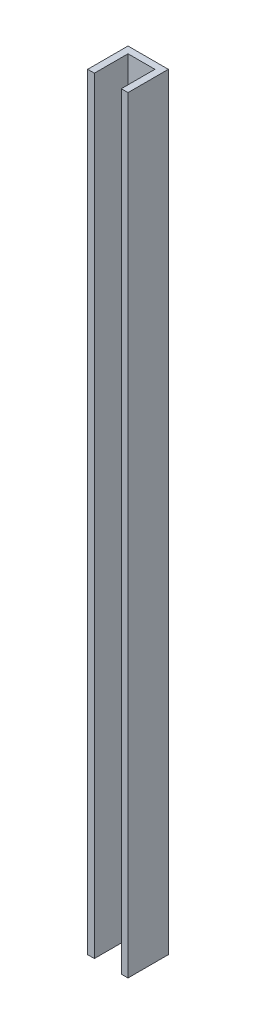
ISO-10303-21;
HEADER;
FILE_DESCRIPTION(('STEP AP214'),'2;1');
FILE_NAME('part.step','',(''),(''),'','','');
FILE_SCHEMA(('AUTOMOTIVE_DESIGN { 1 0 10303 214 1 1 1 1 }'));
ENDSEC;
DATA;
#1=APPLICATION_CONTEXT('core data for automotive mechanical design processes');
#2=APPLICATION_PROTOCOL_DEFINITION('international standard','automotive_design',2000,#1);
#3=PRODUCT_CONTEXT('',#1,'mechanical');
#4=PRODUCT('Part','Part','',(#3));
#5=PRODUCT_RELATED_PRODUCT_CATEGORY('part','',(#4));
#6=PRODUCT_DEFINITION_FORMATION('','',#4);
#7=PRODUCT_DEFINITION_CONTEXT('part definition',#1,'design');
#8=PRODUCT_DEFINITION('design','',#6,#7);
#9=PRODUCT_DEFINITION_SHAPE('','',#8);
#10=(LENGTH_UNIT() NAMED_UNIT(*) SI_UNIT(.MILLI.,.METRE.));
#11=(NAMED_UNIT(*) PLANE_ANGLE_UNIT() SI_UNIT($,.RADIAN.));
#12=(NAMED_UNIT(*) SI_UNIT($,.STERADIAN.) SOLID_ANGLE_UNIT());
#13=UNCERTAINTY_MEASURE_WITH_UNIT(LENGTH_MEASURE(1.E-05),#10,'distance_accuracy_value','');
#14=(GEOMETRIC_REPRESENTATION_CONTEXT(3) GLOBAL_UNCERTAINTY_ASSIGNED_CONTEXT((#13)) GLOBAL_UNIT_ASSIGNED_CONTEXT((#10,
#11,#12)) REPRESENTATION_CONTEXT('',''));
#15=CARTESIAN_POINT('',(0.,0.,0.));
#16=DIRECTION('',(0.,0.,1.));
#17=DIRECTION('',(1.,0.,0.));
#18=AXIS2_PLACEMENT_3D('',#15,#16,#17);
#19=CARTESIAN_POINT('',(3.175,361.95,0.));
#20=DIRECTION('',(0.,0.,-1.));
#21=DIRECTION('',(-1.,0.,0.));
#22=AXIS2_PLACEMENT_3D('',#19,#20,#21);
#23=PLANE('',#22);
#24=DIRECTION('',(1.,0.,0.));
#25=VECTOR('',#24,1.);
#26=CARTESIAN_POINT('',(3.175,0.,0.));
#27=LINE('',#26,#25);
#28=CARTESIAN_POINT('',(0.,0.,0.));
#29=VERTEX_POINT('',#28);
#30=CARTESIAN_POINT('',(3.175,0.,0.));
#31=VERTEX_POINT('',#30);
#32=EDGE_CURVE('E130',#29,#31,#27,.T.);
#33=ORIENTED_EDGE('',*,*,#32,.T.);
#34=DIRECTION('',(0.,-1.,0.));
#35=VECTOR('',#34,1.);
#36=CARTESIAN_POINT('',(3.175,361.95,0.));
#37=LINE('',#36,#35);
#38=CARTESIAN_POINT('',(3.175,361.95,0.));
#39=VERTEX_POINT('',#38);
#40=EDGE_CURVE('E11',#39,#31,#37,.T.);
#41=ORIENTED_EDGE('',*,*,#40,.F.);
#42=DIRECTION('',(1.,0.,0.));
#43=VECTOR('',#42,1.);
#44=CARTESIAN_POINT('',(3.175,361.95,0.));
#45=LINE('',#44,#43);
#46=CARTESIAN_POINT('',(0.,361.95,0.));
#47=VERTEX_POINT('',#46);
#48=EDGE_CURVE('E144',#47,#39,#45,.T.);
#49=ORIENTED_EDGE('',*,*,#48,.F.);
#50=DIRECTION('',(0.,-1.,0.));
#51=VECTOR('',#50,1.);
#52=CARTESIAN_POINT('',(0.,361.95,0.));
#53=LINE('',#52,#51);
#54=EDGE_CURVE('E126',#47,#29,#53,.T.);
#55=ORIENTED_EDGE('',*,*,#54,.T.);
#56=EDGE_LOOP('',(#33,#41,#49,#55));
#57=FACE_BOUND('',#56,.T.);
#58=ADVANCED_FACE('F34',(#57),#23,.F.);
#59=CARTESIAN_POINT('',(3.175,361.95,-15.875));
#60=DIRECTION('',(-1.,0.,0.));
#61=DIRECTION('',(0.,0.,1.));
#62=AXIS2_PLACEMENT_3D('',#59,#60,#61);
#63=PLANE('',#62);
#64=DIRECTION('',(0.,0.,-1.));
#65=VECTOR('',#64,1.);
#66=CARTESIAN_POINT('',(3.175,0.,-15.875));
#67=LINE('',#66,#65);
#68=CARTESIAN_POINT('',(3.175,0.,-15.875));
#69=VERTEX_POINT('',#68);
#70=EDGE_CURVE('E133',#31,#69,#67,.T.);
#71=ORIENTED_EDGE('',*,*,#70,.T.);
#72=DIRECTION('',(0.,-1.,0.));
#73=VECTOR('',#72,1.);
#74=CARTESIAN_POINT('',(3.175,361.95,-15.875));
#75=LINE('',#74,#73);
#76=CARTESIAN_POINT('',(3.175,361.95,-15.875));
#77=VERTEX_POINT('',#76);
#78=EDGE_CURVE('E42',#77,#69,#75,.T.);
#79=ORIENTED_EDGE('',*,*,#78,.F.);
#80=DIRECTION('',(0.,0.,-1.));
#81=VECTOR('',#80,1.);
#82=CARTESIAN_POINT('',(3.175,361.95,-15.875));
#83=LINE('',#82,#81);
#84=EDGE_CURVE('E93',#39,#77,#83,.T.);
#85=ORIENTED_EDGE('',*,*,#84,.F.);
#86=ORIENTED_EDGE('',*,*,#40,.T.);
#87=EDGE_LOOP('',(#71,#79,#85,#86));
#88=FACE_BOUND('',#87,.T.);
#89=ADVANCED_FACE('F179',(#88),#63,.F.);
#90=CARTESIAN_POINT('',(15.875,361.95,-15.875));
#91=DIRECTION('',(0.,0.,-1.));
#92=DIRECTION('',(-1.,0.,0.));
#93=AXIS2_PLACEMENT_3D('',#90,#91,#92);
#94=PLANE('',#93);
#95=DIRECTION('',(1.,0.,0.));
#96=VECTOR('',#95,1.);
#97=CARTESIAN_POINT('',(15.875,0.,-15.875));
#98=LINE('',#97,#96);
#99=CARTESIAN_POINT('',(15.875,0.,-15.875));
#100=VERTEX_POINT('',#99);
#101=EDGE_CURVE('E135',#69,#100,#98,.T.);
#102=ORIENTED_EDGE('',*,*,#101,.T.);
#103=DIRECTION('',(0.,-1.,0.));
#104=VECTOR('',#103,1.);
#105=CARTESIAN_POINT('',(15.875,361.95,-15.875));
#106=LINE('',#105,#104);
#107=CARTESIAN_POINT('',(15.875,361.95,-15.875));
#108=VERTEX_POINT('',#107);
#109=EDGE_CURVE('E151',#108,#100,#106,.T.);
#110=ORIENTED_EDGE('',*,*,#109,.F.);
#111=DIRECTION('',(1.,0.,0.));
#112=VECTOR('',#111,1.);
#113=CARTESIAN_POINT('',(15.875,361.95,-15.875));
#114=LINE('',#113,#112);
#115=EDGE_CURVE('E159',#77,#108,#114,.T.);
#116=ORIENTED_EDGE('',*,*,#115,.F.);
#117=ORIENTED_EDGE('',*,*,#78,.T.);
#118=EDGE_LOOP('',(#102,#110,#116,#117));
#119=FACE_BOUND('',#118,.T.);
#120=ADVANCED_FACE('F157',(#119),#94,.F.);
#121=CARTESIAN_POINT('',(15.875,361.95,0.));
#122=DIRECTION('',(1.,0.,0.));
#123=DIRECTION('',(0.,0.,-1.));
#124=AXIS2_PLACEMENT_3D('',#121,#122,#123);
#125=PLANE('',#124);
#126=DIRECTION('',(0.,0.,1.));
#127=VECTOR('',#126,1.);
#128=CARTESIAN_POINT('',(15.875,0.,0.));
#129=LINE('',#128,#127);
#130=CARTESIAN_POINT('',(15.875,0.,0.));
#131=VERTEX_POINT('',#130);
#132=EDGE_CURVE('E137',#100,#131,#129,.T.);
#133=ORIENTED_EDGE('',*,*,#132,.T.);
#134=DIRECTION('',(0.,-1.,0.));
#135=VECTOR('',#134,1.);
#136=CARTESIAN_POINT('',(15.875,361.95,0.));
#137=LINE('',#136,#135);
#138=CARTESIAN_POINT('',(15.875,361.95,0.));
#139=VERTEX_POINT('',#138);
#140=EDGE_CURVE('E148',#139,#131,#137,.T.);
#141=ORIENTED_EDGE('',*,*,#140,.F.);
#142=DIRECTION('',(0.,0.,1.));
#143=VECTOR('',#142,1.);
#144=CARTESIAN_POINT('',(15.875,361.95,0.));
#145=LINE('',#144,#143);
#146=EDGE_CURVE('E171',#108,#139,#145,.T.);
#147=ORIENTED_EDGE('',*,*,#146,.F.);
#148=ORIENTED_EDGE('',*,*,#109,.T.);
#149=EDGE_LOOP('',(#133,#141,#147,#148));
#150=FACE_BOUND('',#149,.T.);
#151=ADVANCED_FACE('F167',(#150),#125,.F.);
#152=CARTESIAN_POINT('',(19.05,361.95,0.));
#153=DIRECTION('',(0.,0.,-1.));
#154=DIRECTION('',(-1.,0.,0.));
#155=AXIS2_PLACEMENT_3D('',#152,#153,#154);
#156=PLANE('',#155);
#157=DIRECTION('',(1.,0.,0.));
#158=VECTOR('',#157,1.);
#159=CARTESIAN_POINT('',(19.05,0.,0.));
#160=LINE('',#159,#158);
#161=CARTESIAN_POINT('',(19.05,0.,0.));
#162=VERTEX_POINT('',#161);
#163=EDGE_CURVE('E139',#131,#162,#160,.T.);
#164=ORIENTED_EDGE('',*,*,#163,.T.);
#165=DIRECTION('',(0.,-1.,0.));
#166=VECTOR('',#165,1.);
#167=CARTESIAN_POINT('',(19.05,361.95,0.));
#168=LINE('',#167,#166);
#169=CARTESIAN_POINT('',(19.05,361.95,0.));
#170=VERTEX_POINT('',#169);
#171=EDGE_CURVE('E121',#170,#162,#168,.T.);
#172=ORIENTED_EDGE('',*,*,#171,.F.);
#173=DIRECTION('',(1.,0.,0.));
#174=VECTOR('',#173,1.);
#175=CARTESIAN_POINT('',(19.05,361.95,0.));
#176=LINE('',#175,#174);
#177=EDGE_CURVE('E112',#139,#170,#176,.T.);
#178=ORIENTED_EDGE('',*,*,#177,.F.);
#179=ORIENTED_EDGE('',*,*,#140,.T.);
#180=EDGE_LOOP('',(#164,#172,#178,#179));
#181=FACE_BOUND('',#180,.T.);
#182=ADVANCED_FACE('F170',(#181),#156,.F.);
#183=CARTESIAN_POINT('',(19.05,361.95,-19.05));
#184=DIRECTION('',(-1.,0.,0.));
#185=DIRECTION('',(0.,0.,1.));
#186=AXIS2_PLACEMENT_3D('',#183,#184,#185);
#187=PLANE('',#186);
#188=DIRECTION('',(0.,0.,-1.));
#189=VECTOR('',#188,1.);
#190=CARTESIAN_POINT('',(19.05,0.,-19.05));
#191=LINE('',#190,#189);
#192=CARTESIAN_POINT('',(19.05,0.,-19.05));
#193=VERTEX_POINT('',#192);
#194=EDGE_CURVE('E120',#162,#193,#191,.T.);
#195=ORIENTED_EDGE('',*,*,#194,.T.);
#196=DIRECTION('',(0.,-1.,0.));
#197=VECTOR('',#196,1.);
#198=CARTESIAN_POINT('',(19.05,361.95,-19.05));
#199=LINE('',#198,#197);
#200=CARTESIAN_POINT('',(19.05,361.95,-19.05));
#201=VERTEX_POINT('',#200);
#202=EDGE_CURVE('E117',#201,#193,#199,.T.);
#203=ORIENTED_EDGE('',*,*,#202,.F.);
#204=DIRECTION('',(0.,0.,-1.));
#205=VECTOR('',#204,1.);
#206=CARTESIAN_POINT('',(19.05,361.95,-19.05));
#207=LINE('',#206,#205);
#208=EDGE_CURVE('E106',#170,#201,#207,.T.);
#209=ORIENTED_EDGE('',*,*,#208,.F.);
#210=ORIENTED_EDGE('',*,*,#171,.T.);
#211=EDGE_LOOP('',(#195,#203,#209,#210));
#212=FACE_BOUND('',#211,.T.);
#213=ADVANCED_FACE('F118',(#212),#187,.F.);
#214=CARTESIAN_POINT('',(0.,361.95,-19.05));
#215=DIRECTION('',(0.,0.,1.));
#216=DIRECTION('',(1.,0.,0.));
#217=AXIS2_PLACEMENT_3D('',#214,#215,#216);
#218=PLANE('',#217);
#219=DIRECTION('',(-1.,0.,0.));
#220=VECTOR('',#219,1.);
#221=CARTESIAN_POINT('',(0.,0.,-19.05));
#222=LINE('',#221,#220);
#223=CARTESIAN_POINT('',(0.,0.,-19.05));
#224=VERTEX_POINT('',#223);
#225=EDGE_CURVE('E79',#193,#224,#222,.T.);
#226=ORIENTED_EDGE('',*,*,#225,.T.);
#227=DIRECTION('',(0.,-1.,0.));
#228=VECTOR('',#227,1.);
#229=CARTESIAN_POINT('',(0.,361.95,-19.05));
#230=LINE('',#229,#228);
#231=CARTESIAN_POINT('',(0.,361.95,-19.05));
#232=VERTEX_POINT('',#231);
#233=EDGE_CURVE('E122',#232,#224,#230,.T.);
#234=ORIENTED_EDGE('',*,*,#233,.F.);
#235=DIRECTION('',(-1.,0.,0.));
#236=VECTOR('',#235,1.);
#237=CARTESIAN_POINT('',(0.,361.95,-19.05));
#238=LINE('',#237,#236);
#239=EDGE_CURVE('E110',#201,#232,#238,.T.);
#240=ORIENTED_EDGE('',*,*,#239,.F.);
#241=ORIENTED_EDGE('',*,*,#202,.T.);
#242=EDGE_LOOP('',(#226,#234,#240,#241));
#243=FACE_BOUND('',#242,.T.);
#244=ADVANCED_FACE('F124',(#243),#218,.F.);
#245=CARTESIAN_POINT('',(0.,361.95,0.));
#246=DIRECTION('',(1.,0.,0.));
#247=DIRECTION('',(0.,0.,-1.));
#248=AXIS2_PLACEMENT_3D('',#245,#246,#247);
#249=PLANE('',#248);
#250=DIRECTION('',(0.,0.,1.));
#251=VECTOR('',#250,1.);
#252=CARTESIAN_POINT('',(0.,0.,0.));
#253=LINE('',#252,#251);
#254=EDGE_CURVE('E85',#224,#29,#253,.T.);
#255=ORIENTED_EDGE('',*,*,#254,.T.);
#256=ORIENTED_EDGE('',*,*,#54,.F.);
#257=DIRECTION('',(0.,0.,1.));
#258=VECTOR('',#257,1.);
#259=CARTESIAN_POINT('',(0.,361.95,0.));
#260=LINE('',#259,#258);
#261=EDGE_CURVE('E50',#232,#47,#260,.T.);
#262=ORIENTED_EDGE('',*,*,#261,.F.);
#263=ORIENTED_EDGE('',*,*,#233,.T.);
#264=EDGE_LOOP('',(#255,#256,#262,#263));
#265=FACE_BOUND('',#264,.T.);
#266=ADVANCED_FACE('F195',(#265),#249,.F.);
#267=CARTESIAN_POINT('',(0.,361.95,0.));
#268=DIRECTION('',(0.,-1.,0.));
#269=DIRECTION('',(0.,0.,-1.));
#270=AXIS2_PLACEMENT_3D('',#267,#268,#269);
#271=PLANE('',#270);
#272=ORIENTED_EDGE('',*,*,#48,.T.);
#273=ORIENTED_EDGE('',*,*,#84,.T.);
#274=ORIENTED_EDGE('',*,*,#115,.T.);
#275=ORIENTED_EDGE('',*,*,#146,.T.);
#276=ORIENTED_EDGE('',*,*,#177,.T.);
#277=ORIENTED_EDGE('',*,*,#208,.T.);
#278=ORIENTED_EDGE('',*,*,#239,.T.);
#279=ORIENTED_EDGE('',*,*,#261,.T.);
#280=EDGE_LOOP('',(#272,#273,#274,#275,#276,#277,#278,#279));
#281=FACE_BOUND('',#280,.T.);
#282=ADVANCED_FACE('F108',(#281),#271,.F.);
#283=CARTESIAN_POINT('',(0.,0.,0.));
#284=DIRECTION('',(0.,-1.,0.));
#285=DIRECTION('',(0.,0.,-1.));
#286=AXIS2_PLACEMENT_3D('',#283,#284,#285);
#287=PLANE('',#286);
#288=ORIENTED_EDGE('',*,*,#32,.F.);
#289=ORIENTED_EDGE('',*,*,#254,.F.);
#290=ORIENTED_EDGE('',*,*,#225,.F.);
#291=ORIENTED_EDGE('',*,*,#194,.F.);
#292=ORIENTED_EDGE('',*,*,#163,.F.);
#293=ORIENTED_EDGE('',*,*,#132,.F.);
#294=ORIENTED_EDGE('',*,*,#101,.F.);
#295=ORIENTED_EDGE('',*,*,#70,.F.);
#296=EDGE_LOOP('',(#288,#289,#290,#291,#292,#293,#294,#295));
#297=FACE_BOUND('',#296,.T.);
#298=ADVANCED_FACE('F163',(#297),#287,.T.);
#299=CLOSED_SHELL('',(#58,#89,#120,#151,#182,#213,#244,#266,#282,#298));
#300=MANIFOLD_SOLID_BREP('B2',#299);
#301=ADVANCED_BREP_SHAPE_REPRESENTATION('',(#18,#300),#14);
#302=SHAPE_DEFINITION_REPRESENTATION(#9,#301);
ENDSEC;
END-ISO-10303-21;
